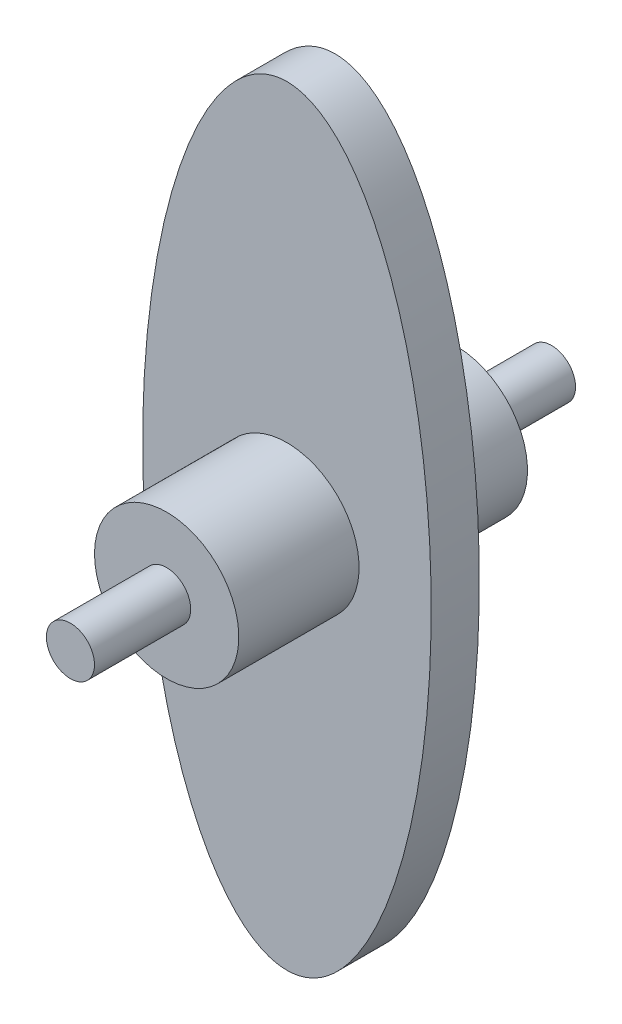
ISO-10303-21;
HEADER;
FILE_DESCRIPTION(('STEP AP214'),'2;1');
FILE_NAME('part.step','',(''),(''),'','','');
FILE_SCHEMA(('AUTOMOTIVE_DESIGN { 1 0 10303 214 1 1 1 1 }'));
ENDSEC;
DATA;
#1=APPLICATION_CONTEXT('core data for automotive mechanical design processes');
#2=APPLICATION_PROTOCOL_DEFINITION('international standard','automotive_design',2000,#1);
#3=PRODUCT_CONTEXT('',#1,'mechanical');
#4=PRODUCT('Part','Part','',(#3));
#5=PRODUCT_RELATED_PRODUCT_CATEGORY('part','',(#4));
#6=PRODUCT_DEFINITION_FORMATION('','',#4);
#7=PRODUCT_DEFINITION_CONTEXT('part definition',#1,'design');
#8=PRODUCT_DEFINITION('design','',#6,#7);
#9=PRODUCT_DEFINITION_SHAPE('','',#8);
#10=(LENGTH_UNIT() NAMED_UNIT(*) SI_UNIT(.MILLI.,.METRE.));
#11=(NAMED_UNIT(*) PLANE_ANGLE_UNIT() SI_UNIT($,.RADIAN.));
#12=(NAMED_UNIT(*) SI_UNIT($,.STERADIAN.) SOLID_ANGLE_UNIT());
#13=UNCERTAINTY_MEASURE_WITH_UNIT(LENGTH_MEASURE(1.E-05),#10,'distance_accuracy_value','');
#14=(GEOMETRIC_REPRESENTATION_CONTEXT(3) GLOBAL_UNCERTAINTY_ASSIGNED_CONTEXT((#13)) GLOBAL_UNIT_ASSIGNED_CONTEXT((#10,
#11,#12)) REPRESENTATION_CONTEXT('',''));
#15=CARTESIAN_POINT('',(0.,0.,0.));
#16=DIRECTION('',(0.,0.,1.));
#17=DIRECTION('',(1.,0.,0.));
#18=AXIS2_PLACEMENT_3D('',#15,#16,#17);
#19=CARTESIAN_POINT('',(0.,0.,3.175));
#20=DIRECTION('',(0.,0.,1.));
#21=DIRECTION('',(0.,1.,0.));
#22=AXIS2_PLACEMENT_3D('',#19,#20,#21);
#23=ELLIPSE('',#22,50.8,19.05);
#24=DIRECTION('',(0.,0.,-1.));
#25=VECTOR('',#24,1.);
#26=SURFACE_OF_LINEAR_EXTRUSION('',#23,#25);
#27=CARTESIAN_POINT('',(0.,50.8,3.175));
#28=VERTEX_POINT('',#27);
#29=EDGE_CURVE('E47',#28,#28,#23,.T.);
#30=ORIENTED_EDGE('',*,*,#29,.F.);
#31=EDGE_LOOP('',(#30));
#32=FACE_BOUND('',#31,.T.);
#33=CARTESIAN_POINT('',(0.,0.,-3.175));
#34=DIRECTION('',(0.,0.,1.));
#35=DIRECTION('',(0.,1.,0.));
#36=AXIS2_PLACEMENT_3D('',#33,#34,#35);
#37=ELLIPSE('',#36,50.8,19.05);
#38=CARTESIAN_POINT('',(0.,50.8,-3.175));
#39=VERTEX_POINT('',#38);
#40=EDGE_CURVE('E60',#39,#39,#37,.T.);
#41=ORIENTED_EDGE('',*,*,#40,.T.);
#42=EDGE_LOOP('',(#41));
#43=FACE_BOUND('',#42,.T.);
#44=ADVANCED_FACE('F34',(#32,#43),#26,.F.);
#45=CARTESIAN_POINT('',(0.,0.,3.175));
#46=DIRECTION('',(0.,0.,1.));
#47=DIRECTION('',(1.,0.,0.));
#48=AXIS2_PLACEMENT_3D('',#45,#46,#47);
#49=PLANE('',#48);
#50=CARTESIAN_POINT('',(0.,0.,3.175));
#51=DIRECTION('',(0.,0.,1.));
#52=DIRECTION('',(1.,0.,0.));
#53=AXIS2_PLACEMENT_3D('',#50,#51,#52);
#54=CIRCLE('',#53,9.525);
#55=CARTESIAN_POINT('',(-9.525,0.,3.175));
#56=VERTEX_POINT('',#55);
#57=EDGE_CURVE('E55',#56,#56,#54,.F.);
#58=ORIENTED_EDGE('',*,*,#57,.T.);
#59=EDGE_LOOP('',(#58));
#60=FACE_BOUND('',#59,.T.);
#61=ORIENTED_EDGE('',*,*,#29,.T.);
#62=EDGE_LOOP('',(#61));
#63=FACE_BOUND('',#62,.T.);
#64=ADVANCED_FACE('F71',(#60,#63),#49,.T.);
#65=CARTESIAN_POINT('',(0.,0.,-3.175));
#66=DIRECTION('',(0.,0.,1.));
#67=DIRECTION('',(1.,0.,0.));
#68=AXIS2_PLACEMENT_3D('',#65,#66,#67);
#69=PLANE('',#68);
#70=CARTESIAN_POINT('',(0.,0.,-3.175));
#71=DIRECTION('',(0.,0.,1.));
#72=DIRECTION('',(1.,0.,0.));
#73=AXIS2_PLACEMENT_3D('',#70,#71,#72);
#74=CIRCLE('',#73,9.525);
#75=CARTESIAN_POINT('',(-9.525,0.,-3.175));
#76=VERTEX_POINT('',#75);
#77=EDGE_CURVE('E42',#76,#76,#74,.F.);
#78=ORIENTED_EDGE('',*,*,#77,.F.);
#79=EDGE_LOOP('',(#78));
#80=FACE_BOUND('',#79,.T.);
#81=ORIENTED_EDGE('',*,*,#40,.F.);
#82=EDGE_LOOP('',(#81));
#83=FACE_BOUND('',#82,.T.);
#84=ADVANCED_FACE('F68',(#80,#83),#69,.F.);
#85=CARTESIAN_POINT('',(0.,0.,-19.05));
#86=DIRECTION('',(0.,0.,1.));
#87=DIRECTION('',(1.,0.,0.));
#88=AXIS2_PLACEMENT_3D('',#85,#86,#87);
#89=PLANE('',#88);
#90=CARTESIAN_POINT('',(0.,0.,-19.05));
#91=DIRECTION('',(0.,0.,1.));
#92=DIRECTION('',(1.,0.,0.));
#93=AXIS2_PLACEMENT_3D('',#90,#91,#92);
#94=CIRCLE('',#93,3.175);
#95=CARTESIAN_POINT('',(3.175,0.,-19.05));
#96=VERTEX_POINT('',#95);
#97=EDGE_CURVE('E10',#96,#96,#94,.F.);
#98=ORIENTED_EDGE('',*,*,#97,.F.);
#99=EDGE_LOOP('',(#98));
#100=FACE_BOUND('',#99,.T.);
#101=CARTESIAN_POINT('',(0.,0.,-19.05));
#102=DIRECTION('',(0.,0.,1.));
#103=DIRECTION('',(1.,0.,0.));
#104=AXIS2_PLACEMENT_3D('',#101,#102,#103);
#105=CIRCLE('',#104,9.525);
#106=CARTESIAN_POINT('',(-9.525,0.,-19.05));
#107=VERTEX_POINT('',#106);
#108=EDGE_CURVE('E56',#107,#107,#105,.T.);
#109=ORIENTED_EDGE('',*,*,#108,.F.);
#110=EDGE_LOOP('',(#109));
#111=FACE_BOUND('',#110,.T.);
#112=ADVANCED_FACE('F70',(#100,#111),#89,.F.);
#113=CARTESIAN_POINT('',(0.,0.,19.05));
#114=DIRECTION('',(0.,0.,-1.));
#115=DIRECTION('',(-1.,0.,0.));
#116=AXIS2_PLACEMENT_3D('',#113,#114,#115);
#117=CYLINDRICAL_SURFACE('',#116,9.525);
#118=CARTESIAN_POINT('',(-9.525,0.,-19.05));
#119=CARTESIAN_POINT('',(-9.525,0.,-18.8846354166667));
#120=CARTESIAN_POINT('',(-9.525,0.,-18.7192708333333));
#121=CARTESIAN_POINT('',(-9.525,0.,-18.3885416666667));
#122=CARTESIAN_POINT('',(-9.525,0.,-18.2231770833333));
#123=CARTESIAN_POINT('',(-9.525,0.,-17.8924479166667));
#124=CARTESIAN_POINT('',(-9.525,0.,-17.7270833333333));
#125=CARTESIAN_POINT('',(-9.525,0.,-17.3963541666667));
#126=CARTESIAN_POINT('',(-9.525,0.,-17.2309895833333));
#127=CARTESIAN_POINT('',(-9.525,0.,-16.9002604166667));
#128=CARTESIAN_POINT('',(-9.525,0.,-16.7348958333333));
#129=CARTESIAN_POINT('',(-9.525,0.,-16.4041666666667));
#130=CARTESIAN_POINT('',(-9.525,0.,-16.2388020833333));
#131=CARTESIAN_POINT('',(-9.525,0.,-15.9080729166667));
#132=CARTESIAN_POINT('',(-9.525,0.,-15.7427083333333));
#133=CARTESIAN_POINT('',(-9.525,0.,-15.4119791666667));
#134=CARTESIAN_POINT('',(-9.525,0.,-15.2466145833333));
#135=CARTESIAN_POINT('',(-9.525,0.,-14.9158854166667));
#136=CARTESIAN_POINT('',(-9.525,0.,-14.7505208333333));
#137=CARTESIAN_POINT('',(-9.525,0.,-14.4197916666667));
#138=CARTESIAN_POINT('',(-9.525,0.,-14.2544270833333));
#139=CARTESIAN_POINT('',(-9.525,0.,-13.9236979166667));
#140=CARTESIAN_POINT('',(-9.525,0.,-13.7583333333333));
#141=CARTESIAN_POINT('',(-9.525,0.,-13.4276041666667));
#142=CARTESIAN_POINT('',(-9.525,0.,-13.2622395833333));
#143=CARTESIAN_POINT('',(-9.525,0.,-12.9315104166667));
#144=CARTESIAN_POINT('',(-9.525,0.,-12.7661458333333));
#145=CARTESIAN_POINT('',(-9.525,0.,-12.4354166666667));
#146=CARTESIAN_POINT('',(-9.525,0.,-12.2700520833333));
#147=CARTESIAN_POINT('',(-9.525,0.,-11.9393229166667));
#148=CARTESIAN_POINT('',(-9.525,0.,-11.7739583333333));
#149=CARTESIAN_POINT('',(-9.525,0.,-11.4432291666667));
#150=CARTESIAN_POINT('',(-9.525,0.,-11.2778645833333));
#151=CARTESIAN_POINT('',(-9.525,0.,-10.9471354166667));
#152=CARTESIAN_POINT('',(-9.525,0.,-10.7817708333333));
#153=CARTESIAN_POINT('',(-9.525,0.,-10.4510416666667));
#154=CARTESIAN_POINT('',(-9.525,0.,-10.2856770833333));
#155=CARTESIAN_POINT('',(-9.525,0.,-9.95494791666667));
#156=CARTESIAN_POINT('',(-9.525,0.,-9.78958333333334));
#157=CARTESIAN_POINT('',(-9.525,0.,-9.45885416666667));
#158=CARTESIAN_POINT('',(-9.525,0.,-9.29348958333334));
#159=CARTESIAN_POINT('',(-9.525,0.,-8.96276041666667));
#160=CARTESIAN_POINT('',(-9.525,0.,-8.79739583333334));
#161=CARTESIAN_POINT('',(-9.525,0.,-8.46666666666667));
#162=CARTESIAN_POINT('',(-9.525,0.,-8.30130208333334));
#163=CARTESIAN_POINT('',(-9.525,0.,-7.97057291666667));
#164=CARTESIAN_POINT('',(-9.525,0.,-7.80520833333334));
#165=CARTESIAN_POINT('',(-9.525,0.,-7.47447916666667));
#166=CARTESIAN_POINT('',(-9.525,0.,-7.30911458333334));
#167=CARTESIAN_POINT('',(-9.525,0.,-6.97838541666667));
#168=CARTESIAN_POINT('',(-9.525,0.,-6.81302083333334));
#169=CARTESIAN_POINT('',(-9.525,0.,-6.48229166666667));
#170=CARTESIAN_POINT('',(-9.525,0.,-6.31692708333334));
#171=CARTESIAN_POINT('',(-9.525,0.,-5.98619791666667));
#172=CARTESIAN_POINT('',(-9.525,0.,-5.82083333333334));
#173=CARTESIAN_POINT('',(-9.525,0.,-5.49010416666667));
#174=CARTESIAN_POINT('',(-9.525,0.,-5.32473958333334));
#175=CARTESIAN_POINT('',(-9.525,0.,-4.99401041666667));
#176=CARTESIAN_POINT('',(-9.525,0.,-4.82864583333334));
#177=CARTESIAN_POINT('',(-9.525,0.,-4.49791666666667));
#178=CARTESIAN_POINT('',(-9.525,0.,-4.33255208333334));
#179=CARTESIAN_POINT('',(-9.525,0.,-4.00182291666667));
#180=CARTESIAN_POINT('',(-9.525,0.,-3.83645833333334));
#181=CARTESIAN_POINT('',(-9.525,0.,-3.50572916666667));
#182=CARTESIAN_POINT('',(-9.525,0.,-3.34036458333334));
#183=CARTESIAN_POINT('',(-9.525,0.,-3.175));
#184=B_SPLINE_CURVE_WITH_KNOTS('',3,(#118,#119,#120,#121,#122,#123,#124,#125,#126,#127,#128,
#129,#130,#131,#132,#133,#134,#135,#136,#137,#138,#139,#140,#141,#142,#143,#144,#145,#146,#147,
#148,#149,#150,#151,#152,#153,#154,#155,#156,#157,#158,#159,#160,#161,#162,#163,#164,#165,#166,
#167,#168,#169,#170,#171,#172,#173,#174,#175,#176,#177,#178,#179,#180,#181,#182,#183),
.UNSPECIFIED.,.F.,.F.,(4,2,2,2,2,2,2,2,2,2,2,2,2,2,2,2,2,2,2,2,2,2,2,2,2,2,2,2,2,2,2,2,4),(0.,
0.496093750000003,0.992187499999998,1.48828125,1.984375,2.48046875,2.9765625,3.47265625,3.96875,
4.46484375,4.9609375,5.45703125,5.953125,6.44921875,6.9453125,7.44140625,7.9375,8.43359375,
8.92968749999999,9.42578125,9.921875,10.41796875,10.9140625,11.41015625,11.90625,12.40234375,
12.8984375,13.39453125,13.890625,14.38671875,14.8828125,15.37890625,15.875),.UNSPECIFIED.);
#185=EDGE_CURVE('BSEAM77',#107,#76,#184,.T.);
#186=ORIENTED_EDGE('',*,*,#108,.T.);
#187=ORIENTED_EDGE('',*,*,#77,.T.);
#188=ORIENTED_EDGE('',*,*,#185,.T.);
#189=ORIENTED_EDGE('',*,*,#185,.F.);
#190=EDGE_LOOP('',(#186,#188,#187,#189));
#191=FACE_BOUND('',#190,.T.);
#192=ADVANCED_FACE('F77',(#191),#117,.T.);
#193=CARTESIAN_POINT('',(0.,0.,19.05));
#194=DIRECTION('',(0.,0.,1.));
#195=DIRECTION('',(1.,0.,0.));
#196=AXIS2_PLACEMENT_3D('',#193,#194,#195);
#197=CIRCLE('',#196,9.525);
#198=CARTESIAN_POINT('',(-9.525,0.,19.05));
#199=VERTEX_POINT('',#198);
#200=EDGE_CURVE('E52',#199,#199,#197,.T.);
#201=CARTESIAN_POINT('',(-9.525,0.,3.175));
#202=CARTESIAN_POINT('',(-9.525,0.,3.34036458333333));
#203=CARTESIAN_POINT('',(-9.525,0.,3.50572916666666));
#204=CARTESIAN_POINT('',(-9.525,0.,3.83645833333333));
#205=CARTESIAN_POINT('',(-9.525,0.,4.00182291666666));
#206=CARTESIAN_POINT('',(-9.525,0.,4.33255208333333));
#207=CARTESIAN_POINT('',(-9.525,0.,4.49791666666666));
#208=CARTESIAN_POINT('',(-9.525,0.,4.82864583333333));
#209=CARTESIAN_POINT('',(-9.525,0.,4.99401041666666));
#210=CARTESIAN_POINT('',(-9.525,0.,5.32473958333333));
#211=CARTESIAN_POINT('',(-9.525,0.,5.49010416666666));
#212=CARTESIAN_POINT('',(-9.525,0.,5.82083333333333));
#213=CARTESIAN_POINT('',(-9.525,0.,5.98619791666666));
#214=CARTESIAN_POINT('',(-9.525,0.,6.31692708333333));
#215=CARTESIAN_POINT('',(-9.525,0.,6.48229166666666));
#216=CARTESIAN_POINT('',(-9.525,0.,6.81302083333333));
#217=CARTESIAN_POINT('',(-9.525,0.,6.97838541666666));
#218=CARTESIAN_POINT('',(-9.525,0.,7.30911458333333));
#219=CARTESIAN_POINT('',(-9.525,0.,7.47447916666667));
#220=CARTESIAN_POINT('',(-9.525,0.,7.80520833333333));
#221=CARTESIAN_POINT('',(-9.525,0.,7.97057291666667));
#222=CARTESIAN_POINT('',(-9.525,0.,8.30130208333333));
#223=CARTESIAN_POINT('',(-9.525,0.,8.46666666666666));
#224=CARTESIAN_POINT('',(-9.525,0.,8.79739583333333));
#225=CARTESIAN_POINT('',(-9.525,0.,8.96276041666667));
#226=CARTESIAN_POINT('',(-9.525,0.,9.29348958333333));
#227=CARTESIAN_POINT('',(-9.525,0.,9.45885416666667));
#228=CARTESIAN_POINT('',(-9.525,0.,9.78958333333333));
#229=CARTESIAN_POINT('',(-9.525,0.,9.95494791666667));
#230=CARTESIAN_POINT('',(-9.525,0.,10.2856770833333));
#231=CARTESIAN_POINT('',(-9.525,0.,10.4510416666667));
#232=CARTESIAN_POINT('',(-9.525,0.,10.7817708333333));
#233=CARTESIAN_POINT('',(-9.525,0.,10.9471354166667));
#234=CARTESIAN_POINT('',(-9.525,0.,11.2778645833333));
#235=CARTESIAN_POINT('',(-9.525,0.,11.4432291666667));
#236=CARTESIAN_POINT('',(-9.525,0.,11.7739583333333));
#237=CARTESIAN_POINT('',(-9.525,0.,11.9393229166667));
#238=CARTESIAN_POINT('',(-9.525,0.,12.2700520833333));
#239=CARTESIAN_POINT('',(-9.525,0.,12.4354166666667));
#240=CARTESIAN_POINT('',(-9.525,0.,12.7661458333333));
#241=CARTESIAN_POINT('',(-9.525,0.,12.9315104166667));
#242=CARTESIAN_POINT('',(-9.525,0.,13.2622395833333));
#243=CARTESIAN_POINT('',(-9.525,0.,13.4276041666667));
#244=CARTESIAN_POINT('',(-9.525,0.,13.7583333333333));
#245=CARTESIAN_POINT('',(-9.525,0.,13.9236979166667));
#246=CARTESIAN_POINT('',(-9.525,0.,14.2544270833333));
#247=CARTESIAN_POINT('',(-9.525,0.,14.4197916666667));
#248=CARTESIAN_POINT('',(-9.525,0.,14.7505208333333));
#249=CARTESIAN_POINT('',(-9.525,0.,14.9158854166667));
#250=CARTESIAN_POINT('',(-9.525,0.,15.2466145833333));
#251=CARTESIAN_POINT('',(-9.525,0.,15.4119791666667));
#252=CARTESIAN_POINT('',(-9.525,0.,15.7427083333333));
#253=CARTESIAN_POINT('',(-9.525,0.,15.9080729166667));
#254=CARTESIAN_POINT('',(-9.525,0.,16.2388020833333));
#255=CARTESIAN_POINT('',(-9.525,0.,16.4041666666667));
#256=CARTESIAN_POINT('',(-9.525,0.,16.7348958333333));
#257=CARTESIAN_POINT('',(-9.525,0.,16.9002604166667));
#258=CARTESIAN_POINT('',(-9.525,0.,17.2309895833333));
#259=CARTESIAN_POINT('',(-9.525,0.,17.3963541666667));
#260=CARTESIAN_POINT('',(-9.525,0.,17.7270833333333));
#261=CARTESIAN_POINT('',(-9.525,0.,17.8924479166667));
#262=CARTESIAN_POINT('',(-9.525,0.,18.2231770833333));
#263=CARTESIAN_POINT('',(-9.525,0.,18.3885416666667));
#264=CARTESIAN_POINT('',(-9.525,0.,18.7192708333333));
#265=CARTESIAN_POINT('',(-9.525,0.,18.8846354166667));
#266=CARTESIAN_POINT('',(-9.525,0.,19.05));
#267=B_SPLINE_CURVE_WITH_KNOTS('',3,(#201,#202,#203,#204,#205,#206,#207,#208,#209,#210,#211,
#212,#213,#214,#215,#216,#217,#218,#219,#220,#221,#222,#223,#224,#225,#226,#227,#228,#229,#230,
#231,#232,#233,#234,#235,#236,#237,#238,#239,#240,#241,#242,#243,#244,#245,#246,#247,#248,#249,
#250,#251,#252,#253,#254,#255,#256,#257,#258,#259,#260,#261,#262,#263,#264,#265,#266),
.UNSPECIFIED.,.F.,.F.,(4,2,2,2,2,2,2,2,2,2,2,2,2,2,2,2,2,2,2,2,2,2,2,2,2,2,2,2,2,2,2,2,4),(0.,
0.496093749999999,0.992187499999998,1.48828125,1.984375,2.48046875,2.9765625,3.47265625,3.96875,
4.46484375,4.9609375,5.45703125,5.953125,6.44921875,6.9453125,7.44140625,7.9375,8.43359375,
8.9296875,9.42578125,9.921875,10.41796875,10.9140625,11.41015625,11.90625,12.40234375,
12.8984375,13.39453125,13.890625,14.38671875,14.8828125,15.37890625,15.875),.UNSPECIFIED.);
#268=EDGE_CURVE('BSEAM106',#56,#199,#267,.T.);
#269=ORIENTED_EDGE('',*,*,#57,.F.);
#270=ORIENTED_EDGE('',*,*,#200,.F.);
#271=ORIENTED_EDGE('',*,*,#268,.T.);
#272=ORIENTED_EDGE('',*,*,#268,.F.);
#273=EDGE_LOOP('',(#269,#271,#270,#272));
#274=FACE_BOUND('',#273,.T.);
#275=ADVANCED_FACE('F106',(#274),#117,.T.);
#276=CARTESIAN_POINT('',(0.,0.,19.05));
#277=DIRECTION('',(0.,0.,1.));
#278=DIRECTION('',(1.,0.,0.));
#279=AXIS2_PLACEMENT_3D('',#276,#277,#278);
#280=PLANE('',#279);
#281=CARTESIAN_POINT('',(0.,0.,19.05));
#282=DIRECTION('',(0.,0.,1.));
#283=DIRECTION('',(1.,0.,0.));
#284=AXIS2_PLACEMENT_3D('',#281,#282,#283);
#285=CIRCLE('',#284,3.175);
#286=CARTESIAN_POINT('',(3.175,0.,19.05));
#287=VERTEX_POINT('',#286);
#288=EDGE_CURVE('E38',#287,#287,#285,.F.);
#289=ORIENTED_EDGE('',*,*,#288,.T.);
#290=EDGE_LOOP('',(#289));
#291=FACE_BOUND('',#290,.T.);
#292=ORIENTED_EDGE('',*,*,#200,.T.);
#293=EDGE_LOOP('',(#292));
#294=FACE_BOUND('',#293,.T.);
#295=ADVANCED_FACE('F116',(#291,#294),#280,.T.);
#296=CARTESIAN_POINT('',(0.,0.,31.75));
#297=DIRECTION('',(0.,0.,1.));
#298=DIRECTION('',(1.,0.,0.));
#299=AXIS2_PLACEMENT_3D('',#296,#297,#298);
#300=PLANE('',#299);
#301=CARTESIAN_POINT('',(0.,0.,31.75));
#302=DIRECTION('',(0.,0.,1.));
#303=DIRECTION('',(1.,0.,0.));
#304=AXIS2_PLACEMENT_3D('',#301,#302,#303);
#305=CIRCLE('',#304,3.175);
#306=CARTESIAN_POINT('',(3.175,0.,31.75));
#307=VERTEX_POINT('',#306);
#308=EDGE_CURVE('E175',#307,#307,#305,.T.);
#309=ORIENTED_EDGE('',*,*,#308,.T.);
#310=EDGE_LOOP('',(#309));
#311=FACE_BOUND('',#310,.T.);
#312=ADVANCED_FACE('F130',(#311),#300,.T.);
#313=CARTESIAN_POINT('',(0.,0.,31.75));
#314=DIRECTION('',(0.,0.,-1.));
#315=DIRECTION('',(-1.,0.,0.));
#316=AXIS2_PLACEMENT_3D('',#313,#314,#315);
#317=CYLINDRICAL_SURFACE('',#316,3.175);
#318=ORIENTED_EDGE('',*,*,#288,.F.);
#319=EDGE_LOOP('',(#318));
#320=FACE_BOUND('',#319,.T.);
#321=ORIENTED_EDGE('',*,*,#308,.F.);
#322=EDGE_LOOP('',(#321));
#323=FACE_BOUND('',#322,.T.);
#324=ADVANCED_FACE('F140',(#320,#323),#317,.T.);
#325=CARTESIAN_POINT('',(0.,0.,-31.75));
#326=DIRECTION('',(0.,0.,1.));
#327=DIRECTION('',(1.,0.,0.));
#328=AXIS2_PLACEMENT_3D('',#325,#326,#327);
#329=CIRCLE('',#328,3.175);
#330=CARTESIAN_POINT('',(3.175,0.,-31.75));
#331=VERTEX_POINT('',#330);
#332=EDGE_CURVE('E50',#331,#331,#329,.T.);
#333=ORIENTED_EDGE('',*,*,#332,.T.);
#334=EDGE_LOOP('',(#333));
#335=FACE_BOUND('',#334,.T.);
#336=ORIENTED_EDGE('',*,*,#97,.T.);
#337=EDGE_LOOP('',(#336));
#338=FACE_BOUND('',#337,.T.);
#339=ADVANCED_FACE('F150',(#335,#338),#317,.T.);
#340=CARTESIAN_POINT('',(0.,0.,-31.75));
#341=DIRECTION('',(0.,0.,1.));
#342=DIRECTION('',(1.,0.,0.));
#343=AXIS2_PLACEMENT_3D('',#340,#341,#342);
#344=PLANE('',#343);
#345=ORIENTED_EDGE('',*,*,#332,.F.);
#346=EDGE_LOOP('',(#345));
#347=FACE_BOUND('',#346,.T.);
#348=ADVANCED_FACE('F160',(#347),#344,.F.);
#349=CLOSED_SHELL('',(#44,#64,#84,#112,#192,#275,#295,#312,#324,#339,#348));
#350=MANIFOLD_SOLID_BREP('B2',#349);
#351=ADVANCED_BREP_SHAPE_REPRESENTATION('',(#18,#350),#14);
#352=SHAPE_DEFINITION_REPRESENTATION(#9,#351);
ENDSEC;
END-ISO-10303-21;
